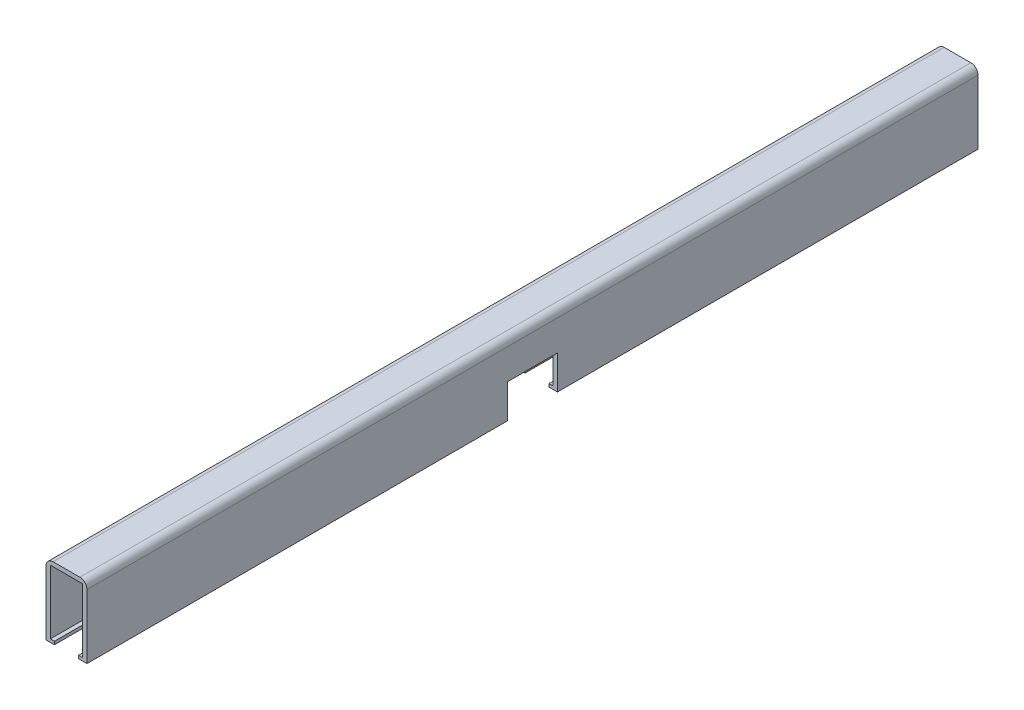
ISO-10303-21;
HEADER;
FILE_DESCRIPTION(('STEP AP214'),'2;1');
FILE_NAME('part.step','',(''),(''),'','','');
FILE_SCHEMA(('AUTOMOTIVE_DESIGN { 1 0 10303 214 1 1 1 1 }'));
ENDSEC;
DATA;
#1=APPLICATION_CONTEXT('core data for automotive mechanical design processes');
#2=APPLICATION_PROTOCOL_DEFINITION('international standard','automotive_design',2000,#1);
#3=PRODUCT_CONTEXT('',#1,'mechanical');
#4=PRODUCT('Part','Part','',(#3));
#5=PRODUCT_RELATED_PRODUCT_CATEGORY('part','',(#4));
#6=PRODUCT_DEFINITION_FORMATION('','',#4);
#7=PRODUCT_DEFINITION_CONTEXT('part definition',#1,'design');
#8=PRODUCT_DEFINITION('design','',#6,#7);
#9=PRODUCT_DEFINITION_SHAPE('','',#8);
#10=(LENGTH_UNIT() NAMED_UNIT(*) SI_UNIT(.MILLI.,.METRE.));
#11=(NAMED_UNIT(*) PLANE_ANGLE_UNIT() SI_UNIT($,.RADIAN.));
#12=(NAMED_UNIT(*) SI_UNIT($,.STERADIAN.) SOLID_ANGLE_UNIT());
#13=UNCERTAINTY_MEASURE_WITH_UNIT(LENGTH_MEASURE(1.E-05),#10,'distance_accuracy_value','');
#14=(GEOMETRIC_REPRESENTATION_CONTEXT(3) GLOBAL_UNCERTAINTY_ASSIGNED_CONTEXT((#13)) GLOBAL_UNIT_ASSIGNED_CONTEXT((#10,
#11,#12)) REPRESENTATION_CONTEXT('',''));
#15=CARTESIAN_POINT('',(0.,0.,0.));
#16=DIRECTION('',(0.,0.,1.));
#17=DIRECTION('',(1.,0.,0.));
#18=AXIS2_PLACEMENT_3D('',#15,#16,#17);
#19=CARTESIAN_POINT('',(-6.785,0.,250.));
#20=DIRECTION('',(0.,1.,0.));
#21=DIRECTION('',(0.,0.,1.));
#22=AXIS2_PLACEMENT_3D('',#19,#20,#21);
#23=PLANE('',#22);
#24=DIRECTION('',(0.,0.,-1.));
#25=VECTOR('',#24,1.);
#26=CARTESIAN_POINT('',(-11.5,0.,250.));
#27=LINE('',#26,#25);
#28=CARTESIAN_POINT('',(-11.5,0.,250.));
#29=VERTEX_POINT('',#28);
#30=CARTESIAN_POINT('',(-11.5,0.,14.));
#31=VERTEX_POINT('',#30);
#32=EDGE_CURVE('E238',#29,#31,#27,.T.);
#33=ORIENTED_EDGE('',*,*,#32,.T.);
#34=DIRECTION('',(1.,0.,0.));
#35=VECTOR('',#34,1.);
#36=CARTESIAN_POINT('',(-11.501,0.,14.));
#37=LINE('',#36,#35);
#38=CARTESIAN_POINT('',(-6.785,0.,14.));
#39=VERTEX_POINT('',#38);
#40=EDGE_CURVE('E214',#31,#39,#37,.T.);
#41=ORIENTED_EDGE('',*,*,#40,.T.);
#42=DIRECTION('',(0.,0.,-1.));
#43=VECTOR('',#42,1.);
#44=CARTESIAN_POINT('',(-6.785,0.,250.));
#45=LINE('',#44,#43);
#46=CARTESIAN_POINT('',(-6.785,0.,250.));
#47=VERTEX_POINT('',#46);
#48=EDGE_CURVE('E229',#47,#39,#45,.T.);
#49=ORIENTED_EDGE('',*,*,#48,.F.);
#50=DIRECTION('',(1.,0.,0.));
#51=VECTOR('',#50,1.);
#52=CARTESIAN_POINT('',(-6.785,0.,250.));
#53=LINE('',#52,#51);
#54=EDGE_CURVE('E372',#29,#47,#53,.T.);
#55=ORIENTED_EDGE('',*,*,#54,.F.);
#56=EDGE_LOOP('',(#33,#41,#49,#55));
#57=FACE_BOUND('',#56,.T.);
#58=ADVANCED_FACE('F32',(#57),#23,.F.);
#59=CARTESIAN_POINT('',(-6.785,0.,250.));
#60=DIRECTION('',(-1.,0.,0.));
#61=DIRECTION('',(0.,0.,1.));
#62=AXIS2_PLACEMENT_3D('',#59,#60,#61);
#63=PLANE('',#62);
#64=ORIENTED_EDGE('',*,*,#48,.T.);
#65=DIRECTION('',(0.,-1.,0.));
#66=VECTOR('',#65,1.);
#67=CARTESIAN_POINT('',(-6.785,19.,14.));
#68=LINE('',#67,#66);
#69=CARTESIAN_POINT('',(-6.785,1.73,14.));
#70=VERTEX_POINT('',#69);
#71=EDGE_CURVE('E223',#70,#39,#68,.T.);
#72=ORIENTED_EDGE('',*,*,#71,.F.);
#73=DIRECTION('',(0.,0.,-1.));
#74=VECTOR('',#73,1.);
#75=CARTESIAN_POINT('',(-6.785,1.73,250.));
#76=LINE('',#75,#74);
#77=CARTESIAN_POINT('',(-6.785,1.73,250.));
#78=VERTEX_POINT('',#77);
#79=EDGE_CURVE('E230',#78,#70,#76,.T.);
#80=ORIENTED_EDGE('',*,*,#79,.F.);
#81=DIRECTION('',(0.,1.,0.));
#82=VECTOR('',#81,1.);
#83=CARTESIAN_POINT('',(-6.785,0.,250.));
#84=LINE('',#83,#82);
#85=EDGE_CURVE('E370',#47,#78,#84,.T.);
#86=ORIENTED_EDGE('',*,*,#85,.F.);
#87=EDGE_LOOP('',(#64,#72,#80,#86));
#88=FACE_BOUND('',#87,.T.);
#89=ADVANCED_FACE('F449',(#88),#63,.F.);
#90=CARTESIAN_POINT('',(-6.785,1.73,250.));
#91=DIRECTION('',(0.,-1.,0.));
#92=DIRECTION('',(1.,0.,0.));
#93=AXIS2_PLACEMENT_3D('',#90,#91,#92);
#94=PLANE('',#93);
#95=ORIENTED_EDGE('',*,*,#79,.T.);
#96=DIRECTION('',(1.,0.,0.));
#97=VECTOR('',#96,1.);
#98=CARTESIAN_POINT('',(-11.501,1.73,14.));
#99=LINE('',#98,#97);
#100=CARTESIAN_POINT('',(-9.07,1.73,14.));
#101=VERTEX_POINT('',#100);
#102=EDGE_CURVE('E420',#101,#70,#99,.T.);
#103=ORIENTED_EDGE('',*,*,#102,.F.);
#104=DIRECTION('',(0.,0.,-1.));
#105=VECTOR('',#104,1.);
#106=CARTESIAN_POINT('',(-9.07,1.73,250.));
#107=LINE('',#106,#105);
#108=CARTESIAN_POINT('',(-9.07,1.73,250.));
#109=VERTEX_POINT('',#108);
#110=EDGE_CURVE('E330',#109,#101,#107,.T.);
#111=ORIENTED_EDGE('',*,*,#110,.F.);
#112=DIRECTION('',(-1.,0.,0.));
#113=VECTOR('',#112,1.);
#114=CARTESIAN_POINT('',(-6.785,1.73,250.));
#115=LINE('',#114,#113);
#116=EDGE_CURVE('E368',#78,#109,#115,.T.);
#117=ORIENTED_EDGE('',*,*,#116,.F.);
#118=EDGE_LOOP('',(#95,#103,#111,#117));
#119=FACE_BOUND('',#118,.T.);
#120=ADVANCED_FACE('F506',(#119),#94,.F.);
#121=CARTESIAN_POINT('',(6.785,0.,250.));
#122=DIRECTION('',(0.,1.,0.));
#123=DIRECTION('',(0.,0.,1.));
#124=AXIS2_PLACEMENT_3D('',#121,#122,#123);
#125=PLANE('',#124);
#126=DIRECTION('',(-1.,0.,0.));
#127=VECTOR('',#126,1.);
#128=CARTESIAN_POINT('',(11.501,0.,14.));
#129=LINE('',#128,#127);
#130=CARTESIAN_POINT('',(11.5,0.,14.));
#131=VERTEX_POINT('',#130);
#132=CARTESIAN_POINT('',(6.785,0.,14.));
#133=VERTEX_POINT('',#132);
#134=EDGE_CURVE('E392',#131,#133,#129,.T.);
#135=ORIENTED_EDGE('',*,*,#134,.F.);
#136=DIRECTION('',(0.,0.,-1.));
#137=VECTOR('',#136,1.);
#138=CARTESIAN_POINT('',(11.5,0.,250.));
#139=LINE('',#138,#137);
#140=CARTESIAN_POINT('',(11.5,0.,250.));
#141=VERTEX_POINT('',#140);
#142=EDGE_CURVE('E11',#141,#131,#139,.T.);
#143=ORIENTED_EDGE('',*,*,#142,.F.);
#144=DIRECTION('',(1.,0.,0.));
#145=VECTOR('',#144,1.);
#146=CARTESIAN_POINT('',(6.785,0.,250.));
#147=LINE('',#146,#145);
#148=CARTESIAN_POINT('',(6.785,0.,250.));
#149=VERTEX_POINT('',#148);
#150=EDGE_CURVE('E312',#149,#141,#147,.T.);
#151=ORIENTED_EDGE('',*,*,#150,.F.);
#152=DIRECTION('',(0.,0.,-1.));
#153=VECTOR('',#152,1.);
#154=CARTESIAN_POINT('',(6.785,0.,250.));
#155=LINE('',#154,#153);
#156=EDGE_CURVE('E313',#149,#133,#155,.T.);
#157=ORIENTED_EDGE('',*,*,#156,.T.);
#158=EDGE_LOOP('',(#135,#143,#151,#157));
#159=FACE_BOUND('',#158,.T.);
#160=ADVANCED_FACE('F34',(#159),#125,.F.);
#161=DIRECTION('',(-1.,0.,0.));
#162=VECTOR('',#161,1.);
#163=CARTESIAN_POINT('',(11.501,0.,-14.));
#164=LINE('',#163,#162);
#165=CARTESIAN_POINT('',(11.5,0.,-14.));
#166=VERTEX_POINT('',#165);
#167=CARTESIAN_POINT('',(6.785,0.,-14.));
#168=VERTEX_POINT('',#167);
#169=EDGE_CURVE('E394',#166,#168,#164,.T.);
#170=ORIENTED_EDGE('',*,*,#169,.T.);
#171=CARTESIAN_POINT('',(6.785,0.,-250.));
#172=VERTEX_POINT('',#171);
#173=EDGE_CURVE('E277',#168,#172,#155,.T.);
#174=ORIENTED_EDGE('',*,*,#173,.T.);
#175=DIRECTION('',(1.,0.,0.));
#176=VECTOR('',#175,1.);
#177=CARTESIAN_POINT('',(6.785,0.,-250.));
#178=LINE('',#177,#176);
#179=CARTESIAN_POINT('',(11.5,0.,-250.));
#180=VERTEX_POINT('',#179);
#181=EDGE_CURVE('E271',#172,#180,#178,.T.);
#182=ORIENTED_EDGE('',*,*,#181,.T.);
#183=EDGE_CURVE('E40',#166,#180,#139,.T.);
#184=ORIENTED_EDGE('',*,*,#183,.F.);
#185=EDGE_LOOP('',(#170,#174,#182,#184));
#186=FACE_BOUND('',#185,.T.);
#187=ADVANCED_FACE('F275',(#186),#125,.F.);
#188=CARTESIAN_POINT('',(11.5,0.,250.));
#189=DIRECTION('',(-1.,0.,0.));
#190=DIRECTION('',(0.,0.,1.));
#191=AXIS2_PLACEMENT_3D('',#188,#189,#190);
#192=PLANE('',#191);
#193=DIRECTION('',(0.,1.,0.));
#194=VECTOR('',#193,1.);
#195=CARTESIAN_POINT('',(11.5,19.,14.));
#196=LINE('',#195,#194);
#197=CARTESIAN_POINT('',(11.5,19.,14.));
#198=VERTEX_POINT('',#197);
#199=EDGE_CURVE('E408',#131,#198,#196,.T.);
#200=ORIENTED_EDGE('',*,*,#199,.T.);
#201=DIRECTION('',(0.,0.,-1.));
#202=VECTOR('',#201,1.);
#203=CARTESIAN_POINT('',(11.5,19.,14.));
#204=LINE('',#203,#202);
#205=CARTESIAN_POINT('',(11.5,19.,-14.));
#206=VERTEX_POINT('',#205);
#207=EDGE_CURVE('E387',#198,#206,#204,.T.);
#208=ORIENTED_EDGE('',*,*,#207,.T.);
#209=DIRECTION('',(0.,-1.,0.));
#210=VECTOR('',#209,1.);
#211=CARTESIAN_POINT('',(11.5,19.,-14.));
#212=LINE('',#211,#210);
#213=EDGE_CURVE('E263',#206,#166,#212,.T.);
#214=ORIENTED_EDGE('',*,*,#213,.T.);
#215=ORIENTED_EDGE('',*,*,#183,.T.);
#216=DIRECTION('',(0.,1.,0.));
#217=VECTOR('',#216,1.);
#218=CARTESIAN_POINT('',(11.5,0.,-250.));
#219=LINE('',#218,#217);
#220=CARTESIAN_POINT('',(11.5,36.,-250.));
#221=VERTEX_POINT('',#220);
#222=EDGE_CURVE('E261',#180,#221,#219,.T.);
#223=ORIENTED_EDGE('',*,*,#222,.T.);
#224=DIRECTION('',(0.,0.,-1.));
#225=VECTOR('',#224,1.);
#226=CARTESIAN_POINT('',(11.5,36.,250.));
#227=LINE('',#226,#225);
#228=CARTESIAN_POINT('',(11.5,36.,250.));
#229=VERTEX_POINT('',#228);
#230=EDGE_CURVE('E249',#229,#221,#227,.T.);
#231=ORIENTED_EDGE('',*,*,#230,.F.);
#232=DIRECTION('',(0.,1.,0.));
#233=VECTOR('',#232,1.);
#234=CARTESIAN_POINT('',(11.5,0.,250.));
#235=LINE('',#234,#233);
#236=EDGE_CURVE('E382',#141,#229,#235,.T.);
#237=ORIENTED_EDGE('',*,*,#236,.F.);
#238=ORIENTED_EDGE('',*,*,#142,.T.);
#239=EDGE_LOOP('',(#200,#208,#214,#215,#223,#231,#237,#238));
#240=FACE_BOUND('',#239,.T.);
#241=ADVANCED_FACE('F260',(#240),#192,.F.);
#242=CARTESIAN_POINT('',(9.07,1.73,250.));
#243=DIRECTION('',(1.,0.,0.));
#244=DIRECTION('',(0.,0.,-1.));
#245=AXIS2_PLACEMENT_3D('',#242,#243,#244);
#246=PLANE('',#245);
#247=DIRECTION('',(0.,-1.,0.));
#248=VECTOR('',#247,1.);
#249=CARTESIAN_POINT('',(9.07,19.,14.));
#250=LINE('',#249,#248);
#251=CARTESIAN_POINT('',(9.07,19.,14.));
#252=VERTEX_POINT('',#251);
#253=CARTESIAN_POINT('',(9.07,1.73,14.));
#254=VERTEX_POINT('',#253);
#255=EDGE_CURVE('E411',#252,#254,#250,.T.);
#256=ORIENTED_EDGE('',*,*,#255,.T.);
#257=DIRECTION('',(0.,0.,-1.));
#258=VECTOR('',#257,1.);
#259=CARTESIAN_POINT('',(9.07,1.73,250.));
#260=LINE('',#259,#258);
#261=CARTESIAN_POINT('',(9.07,1.73,250.));
#262=VERTEX_POINT('',#261);
#263=EDGE_CURVE('E321',#262,#254,#260,.T.);
#264=ORIENTED_EDGE('',*,*,#263,.F.);
#265=DIRECTION('',(0.,-1.,0.));
#266=VECTOR('',#265,1.);
#267=CARTESIAN_POINT('',(9.07,1.73,250.));
#268=LINE('',#267,#266);
#269=CARTESIAN_POINT('',(9.07,37.58,250.));
#270=VERTEX_POINT('',#269);
#271=EDGE_CURVE('E358',#270,#262,#268,.T.);
#272=ORIENTED_EDGE('',*,*,#271,.F.);
#273=DIRECTION('',(0.,0.,-1.));
#274=VECTOR('',#273,1.);
#275=CARTESIAN_POINT('',(9.07,37.58,250.));
#276=LINE('',#275,#274);
#277=CARTESIAN_POINT('',(9.07,37.58,-250.));
#278=VERTEX_POINT('',#277);
#279=EDGE_CURVE('E324',#270,#278,#276,.T.);
#280=ORIENTED_EDGE('',*,*,#279,.T.);
#281=DIRECTION('',(0.,-1.,0.));
#282=VECTOR('',#281,1.);
#283=CARTESIAN_POINT('',(9.07,1.73,-250.));
#284=LINE('',#283,#282);
#285=CARTESIAN_POINT('',(9.07,1.73,-250.));
#286=VERTEX_POINT('',#285);
#287=EDGE_CURVE('E304',#278,#286,#284,.T.);
#288=ORIENTED_EDGE('',*,*,#287,.T.);
#289=CARTESIAN_POINT('',(9.07,1.73,-14.));
#290=VERTEX_POINT('',#289);
#291=EDGE_CURVE('E320',#290,#286,#260,.T.);
#292=ORIENTED_EDGE('',*,*,#291,.F.);
#293=DIRECTION('',(0.,1.,0.));
#294=VECTOR('',#293,1.);
#295=CARTESIAN_POINT('',(9.07,19.,-14.));
#296=LINE('',#295,#294);
#297=CARTESIAN_POINT('',(9.07,19.,-14.));
#298=VERTEX_POINT('',#297);
#299=EDGE_CURVE('E413',#290,#298,#296,.T.);
#300=ORIENTED_EDGE('',*,*,#299,.T.);
#301=DIRECTION('',(0.,0.,1.));
#302=VECTOR('',#301,1.);
#303=CARTESIAN_POINT('',(9.07,19.,14.));
#304=LINE('',#303,#302);
#305=EDGE_CURVE('E389',#298,#252,#304,.T.);
#306=ORIENTED_EDGE('',*,*,#305,.T.);
#307=EDGE_LOOP('',(#256,#264,#272,#280,#288,#292,#300,#306));
#308=FACE_BOUND('',#307,.T.);
#309=ADVANCED_FACE('F355',(#308),#246,.F.);
#310=CARTESIAN_POINT('',(6.785,1.73,250.));
#311=DIRECTION('',(0.,-1.,0.));
#312=DIRECTION('',(1.,0.,0.));
#313=AXIS2_PLACEMENT_3D('',#310,#311,#312);
#314=PLANE('',#313);
#315=DIRECTION('',(-1.,0.,0.));
#316=VECTOR('',#315,1.);
#317=CARTESIAN_POINT('',(11.501,1.73,14.));
#318=LINE('',#317,#316);
#319=CARTESIAN_POINT('',(6.785,1.73,14.));
#320=VERTEX_POINT('',#319);
#321=EDGE_CURVE('E402',#254,#320,#318,.T.);
#322=ORIENTED_EDGE('',*,*,#321,.T.);
#323=DIRECTION('',(0.,0.,-1.));
#324=VECTOR('',#323,1.);
#325=CARTESIAN_POINT('',(6.785,1.73,250.));
#326=LINE('',#325,#324);
#327=CARTESIAN_POINT('',(6.785,1.73,250.));
#328=VERTEX_POINT('',#327);
#329=EDGE_CURVE('E317',#328,#320,#326,.T.);
#330=ORIENTED_EDGE('',*,*,#329,.F.);
#331=DIRECTION('',(-1.,0.,0.));
#332=VECTOR('',#331,1.);
#333=CARTESIAN_POINT('',(6.785,1.73,250.));
#334=LINE('',#333,#332);
#335=EDGE_CURVE('E361',#262,#328,#334,.T.);
#336=ORIENTED_EDGE('',*,*,#335,.F.);
#337=ORIENTED_EDGE('',*,*,#263,.T.);
#338=EDGE_LOOP('',(#322,#330,#336,#337));
#339=FACE_BOUND('',#338,.T.);
#340=ADVANCED_FACE('F483',(#339),#314,.F.);
#341=DIRECTION('',(1.,0.,0.));
#342=VECTOR('',#341,1.);
#343=CARTESIAN_POINT('',(11.501,1.73,-14.));
#344=LINE('',#343,#342);
#345=CARTESIAN_POINT('',(6.785,1.73,-14.));
#346=VERTEX_POINT('',#345);
#347=EDGE_CURVE('E55',#346,#290,#344,.T.);
#348=ORIENTED_EDGE('',*,*,#347,.T.);
#349=ORIENTED_EDGE('',*,*,#291,.T.);
#350=DIRECTION('',(-1.,0.,0.));
#351=VECTOR('',#350,1.);
#352=CARTESIAN_POINT('',(6.785,1.73,-250.));
#353=LINE('',#352,#351);
#354=CARTESIAN_POINT('',(6.785,1.73,-250.));
#355=VERTEX_POINT('',#354);
#356=EDGE_CURVE('E307',#286,#355,#353,.T.);
#357=ORIENTED_EDGE('',*,*,#356,.T.);
#358=EDGE_CURVE('E316',#346,#355,#326,.T.);
#359=ORIENTED_EDGE('',*,*,#358,.F.);
#360=EDGE_LOOP('',(#348,#349,#357,#359));
#361=FACE_BOUND('',#360,.T.);
#362=ADVANCED_FACE('F492',(#361),#314,.F.);
#363=CARTESIAN_POINT('',(6.785,0.,250.));
#364=DIRECTION('',(1.,0.,0.));
#365=DIRECTION('',(0.,0.,-1.));
#366=AXIS2_PLACEMENT_3D('',#363,#364,#365);
#367=PLANE('',#366);
#368=DIRECTION('',(0.,-1.,0.));
#369=VECTOR('',#368,1.);
#370=CARTESIAN_POINT('',(6.785,19.,14.));
#371=LINE('',#370,#369);
#372=EDGE_CURVE('E405',#320,#133,#371,.T.);
#373=ORIENTED_EDGE('',*,*,#372,.T.);
#374=ORIENTED_EDGE('',*,*,#156,.F.);
#375=DIRECTION('',(0.,-1.,0.));
#376=VECTOR('',#375,1.);
#377=CARTESIAN_POINT('',(6.785,0.,250.));
#378=LINE('',#377,#376);
#379=EDGE_CURVE('E283',#328,#149,#378,.T.);
#380=ORIENTED_EDGE('',*,*,#379,.F.);
#381=ORIENTED_EDGE('',*,*,#329,.T.);
#382=EDGE_LOOP('',(#373,#374,#380,#381));
#383=FACE_BOUND('',#382,.T.);
#384=ADVANCED_FACE('F479',(#383),#367,.F.);
#385=DIRECTION('',(0.,1.,0.));
#386=VECTOR('',#385,1.);
#387=CARTESIAN_POINT('',(6.785,19.,-14.));
#388=LINE('',#387,#386);
#389=EDGE_CURVE('E280',#168,#346,#388,.T.);
#390=ORIENTED_EDGE('',*,*,#389,.T.);
#391=ORIENTED_EDGE('',*,*,#358,.T.);
#392=DIRECTION('',(0.,-1.,0.));
#393=VECTOR('',#392,1.);
#394=CARTESIAN_POINT('',(6.785,0.,-250.));
#395=LINE('',#394,#393);
#396=EDGE_CURVE('E310',#355,#172,#395,.T.);
#397=ORIENTED_EDGE('',*,*,#396,.T.);
#398=ORIENTED_EDGE('',*,*,#173,.F.);
#399=EDGE_LOOP('',(#390,#391,#397,#398));
#400=FACE_BOUND('',#399,.T.);
#401=ADVANCED_FACE('F489',(#400),#367,.F.);
#402=CARTESIAN_POINT('',(7.5,36.,250.));
#403=DIRECTION('',(0.,0.,-1.));
#404=DIRECTION('',(-1.,0.,0.));
#405=AXIS2_PLACEMENT_3D('',#402,#403,#404);
#406=CYLINDRICAL_SURFACE('',#405,4.);
#407=CARTESIAN_POINT('',(7.5,36.,-250.));
#408=DIRECTION('',(0.,0.,1.));
#409=DIRECTION('',(1.,0.,0.));
#410=AXIS2_PLACEMENT_3D('',#407,#408,#409);
#411=CIRCLE('',#410,4.);
#412=CARTESIAN_POINT('',(7.49999999999997,40.,-250.));
#413=VERTEX_POINT('',#412);
#414=EDGE_CURVE('E273',#221,#413,#411,.T.);
#415=ORIENTED_EDGE('',*,*,#414,.T.);
#416=DIRECTION('',(0.,0.,-1.));
#417=VECTOR('',#416,1.);
#418=CARTESIAN_POINT('',(7.49999999999997,40.,250.));
#419=LINE('',#418,#417);
#420=CARTESIAN_POINT('',(7.49999999999997,40.,250.));
#421=VERTEX_POINT('',#420);
#422=EDGE_CURVE('E247',#421,#413,#419,.T.);
#423=ORIENTED_EDGE('',*,*,#422,.F.);
#424=CARTESIAN_POINT('',(7.5,36.,250.));
#425=DIRECTION('',(0.,0.,1.));
#426=DIRECTION('',(1.,0.,0.));
#427=AXIS2_PLACEMENT_3D('',#424,#425,#426);
#428=CIRCLE('',#427,4.);
#429=EDGE_CURVE('E380',#229,#421,#428,.T.);
#430=ORIENTED_EDGE('',*,*,#429,.F.);
#431=ORIENTED_EDGE('',*,*,#230,.T.);
#432=EDGE_LOOP('',(#415,#423,#430,#431));
#433=FACE_BOUND('',#432,.T.);
#434=ADVANCED_FACE('F469',(#433),#406,.T.);
#435=CARTESIAN_POINT('',(7.49999999999997,40.,250.));
#436=DIRECTION('',(0.,-1.,0.));
#437=DIRECTION('',(0.,0.,-1.));
#438=AXIS2_PLACEMENT_3D('',#435,#436,#437);
#439=PLANE('',#438);
#440=DIRECTION('',(-1.,0.,0.));
#441=VECTOR('',#440,1.);
#442=CARTESIAN_POINT('',(7.49999999999997,40.,-250.));
#443=LINE('',#442,#441);
#444=CARTESIAN_POINT('',(-7.49999999999997,40.,-250.));
#445=VERTEX_POINT('',#444);
#446=EDGE_CURVE('E287',#413,#445,#443,.T.);
#447=ORIENTED_EDGE('',*,*,#446,.T.);
#448=DIRECTION('',(0.,0.,-1.));
#449=VECTOR('',#448,1.);
#450=CARTESIAN_POINT('',(-7.49999999999997,40.,250.));
#451=LINE('',#450,#449);
#452=CARTESIAN_POINT('',(-7.49999999999997,40.,250.));
#453=VERTEX_POINT('',#452);
#454=EDGE_CURVE('E244',#453,#445,#451,.T.);
#455=ORIENTED_EDGE('',*,*,#454,.F.);
#456=DIRECTION('',(-1.,0.,0.));
#457=VECTOR('',#456,1.);
#458=CARTESIAN_POINT('',(7.49999999999997,40.,250.));
#459=LINE('',#458,#457);
#460=EDGE_CURVE('E378',#421,#453,#459,.T.);
#461=ORIENTED_EDGE('',*,*,#460,.F.);
#462=ORIENTED_EDGE('',*,*,#422,.T.);
#463=EDGE_LOOP('',(#447,#455,#461,#462));
#464=FACE_BOUND('',#463,.T.);
#465=ADVANCED_FACE('F467',(#464),#439,.F.);
#466=CARTESIAN_POINT('',(-7.5,36.,250.));
#467=DIRECTION('',(0.,0.,-1.));
#468=DIRECTION('',(-1.,0.,0.));
#469=AXIS2_PLACEMENT_3D('',#466,#467,#468);
#470=CYLINDRICAL_SURFACE('',#469,4.);
#471=CARTESIAN_POINT('',(-7.5,36.,-250.));
#472=DIRECTION('',(0.,0.,1.));
#473=DIRECTION('',(-1.,0.,0.));
#474=AXIS2_PLACEMENT_3D('',#471,#472,#473);
#475=CIRCLE('',#474,4.);
#476=CARTESIAN_POINT('',(-11.5,36.,-250.));
#477=VERTEX_POINT('',#476);
#478=EDGE_CURVE('E289',#445,#477,#475,.T.);
#479=ORIENTED_EDGE('',*,*,#478,.T.);
#480=DIRECTION('',(0.,0.,-1.));
#481=VECTOR('',#480,1.);
#482=CARTESIAN_POINT('',(-11.5,36.,250.));
#483=LINE('',#482,#481);
#484=CARTESIAN_POINT('',(-11.5,36.,250.));
#485=VERTEX_POINT('',#484);
#486=EDGE_CURVE('E241',#485,#477,#483,.T.);
#487=ORIENTED_EDGE('',*,*,#486,.F.);
#488=CARTESIAN_POINT('',(-7.5,36.,250.));
#489=DIRECTION('',(0.,0.,1.));
#490=DIRECTION('',(-1.,0.,0.));
#491=AXIS2_PLACEMENT_3D('',#488,#489,#490);
#492=CIRCLE('',#491,4.);
#493=EDGE_CURVE('E376',#453,#485,#492,.T.);
#494=ORIENTED_EDGE('',*,*,#493,.F.);
#495=ORIENTED_EDGE('',*,*,#454,.T.);
#496=EDGE_LOOP('',(#479,#487,#494,#495));
#497=FACE_BOUND('',#496,.T.);
#498=ADVANCED_FACE('F463',(#497),#470,.T.);
#499=CARTESIAN_POINT('',(-11.5,0.,250.));
#500=DIRECTION('',(1.,0.,0.));
#501=DIRECTION('',(0.,0.,-1.));
#502=AXIS2_PLACEMENT_3D('',#499,#500,#501);
#503=PLANE('',#502);
#504=DIRECTION('',(0.,0.,-1.));
#505=VECTOR('',#504,1.);
#506=CARTESIAN_POINT('',(-11.5,19.,14.));
#507=LINE('',#506,#505);
#508=CARTESIAN_POINT('',(-11.5,19.,14.));
#509=VERTEX_POINT('',#508);
#510=CARTESIAN_POINT('',(-11.5,19.,-14.));
#511=VERTEX_POINT('',#510);
#512=EDGE_CURVE('E433',#509,#511,#507,.T.);
#513=ORIENTED_EDGE('',*,*,#512,.F.);
#514=DIRECTION('',(0.,1.,0.));
#515=VECTOR('',#514,1.);
#516=CARTESIAN_POINT('',(-11.5,19.,14.));
#517=LINE('',#516,#515);
#518=EDGE_CURVE('E430',#31,#509,#517,.T.);
#519=ORIENTED_EDGE('',*,*,#518,.F.);
#520=ORIENTED_EDGE('',*,*,#32,.F.);
#521=DIRECTION('',(0.,-1.,0.));
#522=VECTOR('',#521,1.);
#523=CARTESIAN_POINT('',(-11.5,0.,250.));
#524=LINE('',#523,#522);
#525=EDGE_CURVE('E374',#485,#29,#524,.T.);
#526=ORIENTED_EDGE('',*,*,#525,.F.);
#527=ORIENTED_EDGE('',*,*,#486,.T.);
#528=DIRECTION('',(0.,-1.,0.));
#529=VECTOR('',#528,1.);
#530=CARTESIAN_POINT('',(-11.5,0.,-250.));
#531=LINE('',#530,#529);
#532=CARTESIAN_POINT('',(-11.5,0.,-250.));
#533=VERTEX_POINT('',#532);
#534=EDGE_CURVE('E291',#477,#533,#531,.T.);
#535=ORIENTED_EDGE('',*,*,#534,.T.);
#536=CARTESIAN_POINT('',(-11.5,0.,-14.));
#537=VERTEX_POINT('',#536);
#538=EDGE_CURVE('E233',#537,#533,#27,.T.);
#539=ORIENTED_EDGE('',*,*,#538,.F.);
#540=DIRECTION('',(0.,-1.,0.));
#541=VECTOR('',#540,1.);
#542=CARTESIAN_POINT('',(-11.5,19.,-14.));
#543=LINE('',#542,#541);
#544=EDGE_CURVE('E209',#511,#537,#543,.T.);
#545=ORIENTED_EDGE('',*,*,#544,.F.);
#546=EDGE_LOOP('',(#513,#519,#520,#526,#527,#535,#539,#545));
#547=FACE_BOUND('',#546,.T.);
#548=ADVANCED_FACE('F457',(#547),#503,.F.);
#549=CARTESIAN_POINT('',(-6.785,0.,-14.));
#550=VERTEX_POINT('',#549);
#551=CARTESIAN_POINT('',(-6.785,0.,-250.));
#552=VERTEX_POINT('',#551);
#553=EDGE_CURVE('E220',#550,#552,#45,.T.);
#554=ORIENTED_EDGE('',*,*,#553,.F.);
#555=DIRECTION('',(1.,0.,0.));
#556=VECTOR('',#555,1.);
#557=CARTESIAN_POINT('',(-11.501,0.,-14.));
#558=LINE('',#557,#556);
#559=EDGE_CURVE('E204',#537,#550,#558,.T.);
#560=ORIENTED_EDGE('',*,*,#559,.F.);
#561=ORIENTED_EDGE('',*,*,#538,.T.);
#562=DIRECTION('',(1.,0.,0.));
#563=VECTOR('',#562,1.);
#564=CARTESIAN_POINT('',(-6.785,0.,-250.));
#565=LINE('',#564,#563);
#566=EDGE_CURVE('E227',#533,#552,#565,.T.);
#567=ORIENTED_EDGE('',*,*,#566,.T.);
#568=EDGE_LOOP('',(#554,#560,#561,#567));
#569=FACE_BOUND('',#568,.T.);
#570=ADVANCED_FACE('F225',(#569),#23,.F.);
#571=CARTESIAN_POINT('',(-6.785,1.73,-14.));
#572=VERTEX_POINT('',#571);
#573=CARTESIAN_POINT('',(-6.785,1.73,-250.));
#574=VERTEX_POINT('',#573);
#575=EDGE_CURVE('E222',#572,#574,#76,.T.);
#576=ORIENTED_EDGE('',*,*,#575,.F.);
#577=DIRECTION('',(0.,1.,0.));
#578=VECTOR('',#577,1.);
#579=CARTESIAN_POINT('',(-6.785,19.,-14.));
#580=LINE('',#579,#578);
#581=EDGE_CURVE('E207',#550,#572,#580,.T.);
#582=ORIENTED_EDGE('',*,*,#581,.F.);
#583=ORIENTED_EDGE('',*,*,#553,.T.);
#584=DIRECTION('',(0.,1.,0.));
#585=VECTOR('',#584,1.);
#586=CARTESIAN_POINT('',(-6.785,0.,-250.));
#587=LINE('',#586,#585);
#588=EDGE_CURVE('E295',#552,#574,#587,.T.);
#589=ORIENTED_EDGE('',*,*,#588,.T.);
#590=EDGE_LOOP('',(#576,#582,#583,#589));
#591=FACE_BOUND('',#590,.T.);
#592=ADVANCED_FACE('F218',(#591),#63,.F.);
#593=CARTESIAN_POINT('',(-9.07,1.73,-14.));
#594=VERTEX_POINT('',#593);
#595=CARTESIAN_POINT('',(-9.07,1.73,-250.));
#596=VERTEX_POINT('',#595);
#597=EDGE_CURVE('E329',#594,#596,#107,.T.);
#598=ORIENTED_EDGE('',*,*,#597,.F.);
#599=DIRECTION('',(-1.,0.,0.));
#600=VECTOR('',#599,1.);
#601=CARTESIAN_POINT('',(-11.501,1.73,-14.));
#602=LINE('',#601,#600);
#603=EDGE_CURVE('E47',#572,#594,#602,.T.);
#604=ORIENTED_EDGE('',*,*,#603,.F.);
#605=ORIENTED_EDGE('',*,*,#575,.T.);
#606=DIRECTION('',(-1.,0.,0.));
#607=VECTOR('',#606,1.);
#608=CARTESIAN_POINT('',(-6.785,1.73,-250.));
#609=LINE('',#608,#607);
#610=EDGE_CURVE('E297',#574,#596,#609,.T.);
#611=ORIENTED_EDGE('',*,*,#610,.T.);
#612=EDGE_LOOP('',(#598,#604,#605,#611));
#613=FACE_BOUND('',#612,.T.);
#614=ADVANCED_FACE('F344',(#613),#94,.F.);
#615=CARTESIAN_POINT('',(-9.07,1.73,250.));
#616=DIRECTION('',(-1.,0.,0.));
#617=DIRECTION('',(0.,0.,1.));
#618=AXIS2_PLACEMENT_3D('',#615,#616,#617);
#619=PLANE('',#618);
#620=ORIENTED_EDGE('',*,*,#110,.T.);
#621=DIRECTION('',(0.,-1.,0.));
#622=VECTOR('',#621,1.);
#623=CARTESIAN_POINT('',(-9.07,19.,14.));
#624=LINE('',#623,#622);
#625=CARTESIAN_POINT('',(-9.07,19.,14.));
#626=VERTEX_POINT('',#625);
#627=EDGE_CURVE('E425',#626,#101,#624,.T.);
#628=ORIENTED_EDGE('',*,*,#627,.F.);
#629=DIRECTION('',(0.,0.,1.));
#630=VECTOR('',#629,1.);
#631=CARTESIAN_POINT('',(-9.07,19.,14.));
#632=LINE('',#631,#630);
#633=CARTESIAN_POINT('',(-9.07,19.,-14.));
#634=VERTEX_POINT('',#633);
#635=EDGE_CURVE('E427',#634,#626,#632,.T.);
#636=ORIENTED_EDGE('',*,*,#635,.F.);
#637=DIRECTION('',(0.,1.,0.));
#638=VECTOR('',#637,1.);
#639=CARTESIAN_POINT('',(-9.07,19.,-14.));
#640=LINE('',#639,#638);
#641=EDGE_CURVE('E341',#594,#634,#640,.T.);
#642=ORIENTED_EDGE('',*,*,#641,.F.);
#643=ORIENTED_EDGE('',*,*,#597,.T.);
#644=DIRECTION('',(0.,1.,0.));
#645=VECTOR('',#644,1.);
#646=CARTESIAN_POINT('',(-9.07,1.73,-250.));
#647=LINE('',#646,#645);
#648=CARTESIAN_POINT('',(-9.07,37.58,-250.));
#649=VERTEX_POINT('',#648);
#650=EDGE_CURVE('E300',#596,#649,#647,.T.);
#651=ORIENTED_EDGE('',*,*,#650,.T.);
#652=DIRECTION('',(0.,0.,-1.));
#653=VECTOR('',#652,1.);
#654=CARTESIAN_POINT('',(-9.07,37.58,250.));
#655=LINE('',#654,#653);
#656=CARTESIAN_POINT('',(-9.07,37.58,250.));
#657=VERTEX_POINT('',#656);
#658=EDGE_CURVE('E327',#657,#649,#655,.T.);
#659=ORIENTED_EDGE('',*,*,#658,.F.);
#660=DIRECTION('',(0.,1.,0.));
#661=VECTOR('',#660,1.);
#662=CARTESIAN_POINT('',(-9.07,1.73,250.));
#663=LINE('',#662,#661);
#664=EDGE_CURVE('E364',#109,#657,#663,.T.);
#665=ORIENTED_EDGE('',*,*,#664,.F.);
#666=EDGE_LOOP('',(#620,#628,#636,#642,#643,#651,#659,#665));
#667=FACE_BOUND('',#666,.T.);
#668=ADVANCED_FACE('F337',(#667),#619,.F.);
#669=CARTESIAN_POINT('',(9.07,37.58,250.));
#670=DIRECTION('',(0.,1.,0.));
#671=DIRECTION('',(0.,0.,1.));
#672=AXIS2_PLACEMENT_3D('',#669,#670,#671);
#673=PLANE('',#672);
#674=DIRECTION('',(1.,0.,0.));
#675=VECTOR('',#674,1.);
#676=CARTESIAN_POINT('',(9.07,37.58,-250.));
#677=LINE('',#676,#675);
#678=EDGE_CURVE('E302',#649,#278,#677,.T.);
#679=ORIENTED_EDGE('',*,*,#678,.T.);
#680=ORIENTED_EDGE('',*,*,#279,.F.);
#681=DIRECTION('',(1.,0.,0.));
#682=VECTOR('',#681,1.);
#683=CARTESIAN_POINT('',(9.07,37.58,250.));
#684=LINE('',#683,#682);
#685=EDGE_CURVE('E362',#657,#270,#684,.T.);
#686=ORIENTED_EDGE('',*,*,#685,.F.);
#687=ORIENTED_EDGE('',*,*,#658,.T.);
#688=EDGE_LOOP('',(#679,#680,#686,#687));
#689=FACE_BOUND('',#688,.T.);
#690=ADVANCED_FACE('F350',(#689),#673,.F.);
#691=CARTESIAN_POINT('',(7.5,36.,250.));
#692=DIRECTION('',(0.,0.,1.));
#693=DIRECTION('',(1.,0.,0.));
#694=AXIS2_PLACEMENT_3D('',#691,#692,#693);
#695=PLANE('',#694);
#696=ORIENTED_EDGE('',*,*,#150,.T.);
#697=ORIENTED_EDGE('',*,*,#236,.T.);
#698=ORIENTED_EDGE('',*,*,#429,.T.);
#699=ORIENTED_EDGE('',*,*,#460,.T.);
#700=ORIENTED_EDGE('',*,*,#493,.T.);
#701=ORIENTED_EDGE('',*,*,#525,.T.);
#702=ORIENTED_EDGE('',*,*,#54,.T.);
#703=ORIENTED_EDGE('',*,*,#85,.T.);
#704=ORIENTED_EDGE('',*,*,#116,.T.);
#705=ORIENTED_EDGE('',*,*,#664,.T.);
#706=ORIENTED_EDGE('',*,*,#685,.T.);
#707=ORIENTED_EDGE('',*,*,#271,.T.);
#708=ORIENTED_EDGE('',*,*,#335,.T.);
#709=ORIENTED_EDGE('',*,*,#379,.T.);
#710=EDGE_LOOP('',(#696,#697,#698,#699,#700,#701,#702,#703,#704,#705,#706,#707,#708,#709));
#711=FACE_BOUND('',#710,.T.);
#712=ADVANCED_FACE('F451',(#711),#695,.T.);
#713=CARTESIAN_POINT('',(7.5,36.,-250.));
#714=DIRECTION('',(0.,0.,1.));
#715=DIRECTION('',(1.,0.,0.));
#716=AXIS2_PLACEMENT_3D('',#713,#714,#715);
#717=PLANE('',#716);
#718=ORIENTED_EDGE('',*,*,#181,.F.);
#719=ORIENTED_EDGE('',*,*,#396,.F.);
#720=ORIENTED_EDGE('',*,*,#356,.F.);
#721=ORIENTED_EDGE('',*,*,#287,.F.);
#722=ORIENTED_EDGE('',*,*,#678,.F.);
#723=ORIENTED_EDGE('',*,*,#650,.F.);
#724=ORIENTED_EDGE('',*,*,#610,.F.);
#725=ORIENTED_EDGE('',*,*,#588,.F.);
#726=ORIENTED_EDGE('',*,*,#566,.F.);
#727=ORIENTED_EDGE('',*,*,#534,.F.);
#728=ORIENTED_EDGE('',*,*,#478,.F.);
#729=ORIENTED_EDGE('',*,*,#446,.F.);
#730=ORIENTED_EDGE('',*,*,#414,.F.);
#731=ORIENTED_EDGE('',*,*,#222,.F.);
#732=EDGE_LOOP('',(#718,#719,#720,#721,#722,#723,#724,#725,#726,#727,#728,#729,#730,#731));
#733=FACE_BOUND('',#732,.T.);
#734=ADVANCED_FACE('F269',(#733),#717,.F.);
#735=CARTESIAN_POINT('',(11.501,19.,14.));
#736=DIRECTION('',(0.,0.,-1.));
#737=DIRECTION('',(0.,1.,0.));
#738=AXIS2_PLACEMENT_3D('',#735,#736,#737);
#739=PLANE('',#738);
#740=ORIENTED_EDGE('',*,*,#134,.T.);
#741=ORIENTED_EDGE('',*,*,#372,.F.);
#742=ORIENTED_EDGE('',*,*,#321,.F.);
#743=ORIENTED_EDGE('',*,*,#255,.F.);
#744=DIRECTION('',(-1.,0.,0.));
#745=VECTOR('',#744,1.);
#746=CARTESIAN_POINT('',(11.501,19.,14.));
#747=LINE('',#746,#745);
#748=EDGE_CURVE('E399',#198,#252,#747,.T.);
#749=ORIENTED_EDGE('',*,*,#748,.F.);
#750=ORIENTED_EDGE('',*,*,#199,.F.);
#751=EDGE_LOOP('',(#740,#741,#742,#743,#749,#750));
#752=FACE_BOUND('',#751,.T.);
#753=ADVANCED_FACE('F476',(#752),#739,.T.);
#754=CARTESIAN_POINT('',(11.501,19.,-14.));
#755=DIRECTION('',(0.,0.,1.));
#756=DIRECTION('',(0.,-1.,0.));
#757=AXIS2_PLACEMENT_3D('',#754,#755,#756);
#758=PLANE('',#757);
#759=DIRECTION('',(-1.,0.,0.));
#760=VECTOR('',#759,1.);
#761=CARTESIAN_POINT('',(11.501,19.,-14.));
#762=LINE('',#761,#760);
#763=EDGE_CURVE('E396',#206,#298,#762,.T.);
#764=ORIENTED_EDGE('',*,*,#763,.T.);
#765=ORIENTED_EDGE('',*,*,#299,.F.);
#766=ORIENTED_EDGE('',*,*,#347,.F.);
#767=ORIENTED_EDGE('',*,*,#389,.F.);
#768=ORIENTED_EDGE('',*,*,#169,.F.);
#769=ORIENTED_EDGE('',*,*,#213,.F.);
#770=EDGE_LOOP('',(#764,#765,#766,#767,#768,#769));
#771=FACE_BOUND('',#770,.T.);
#772=ADVANCED_FACE('F487',(#771),#758,.T.);
#773=CARTESIAN_POINT('',(11.501,19.,14.));
#774=DIRECTION('',(0.,-1.,0.));
#775=DIRECTION('',(0.,0.,-1.));
#776=AXIS2_PLACEMENT_3D('',#773,#774,#775);
#777=PLANE('',#776);
#778=ORIENTED_EDGE('',*,*,#748,.T.);
#779=ORIENTED_EDGE('',*,*,#305,.F.);
#780=ORIENTED_EDGE('',*,*,#763,.F.);
#781=ORIENTED_EDGE('',*,*,#207,.F.);
#782=EDGE_LOOP('',(#778,#779,#780,#781));
#783=FACE_BOUND('',#782,.T.);
#784=ADVANCED_FACE('F486',(#783),#777,.T.);
#785=CARTESIAN_POINT('',(-11.501,19.,14.));
#786=DIRECTION('',(0.,0.,1.));
#787=DIRECTION('',(0.,-1.,0.));
#788=AXIS2_PLACEMENT_3D('',#785,#786,#787);
#789=PLANE('',#788);
#790=ORIENTED_EDGE('',*,*,#518,.T.);
#791=DIRECTION('',(1.,0.,0.));
#792=VECTOR('',#791,1.);
#793=CARTESIAN_POINT('',(-11.501,19.,14.));
#794=LINE('',#793,#792);
#795=EDGE_CURVE('E418',#509,#626,#794,.T.);
#796=ORIENTED_EDGE('',*,*,#795,.T.);
#797=ORIENTED_EDGE('',*,*,#627,.T.);
#798=ORIENTED_EDGE('',*,*,#102,.T.);
#799=ORIENTED_EDGE('',*,*,#71,.T.);
#800=ORIENTED_EDGE('',*,*,#40,.F.);
#801=EDGE_LOOP('',(#790,#796,#797,#798,#799,#800));
#802=FACE_BOUND('',#801,.T.);
#803=ADVANCED_FACE('F439',(#802),#789,.F.);
#804=CARTESIAN_POINT('',(-11.501,19.,14.));
#805=DIRECTION('',(0.,1.,0.));
#806=DIRECTION('',(0.,0.,1.));
#807=AXIS2_PLACEMENT_3D('',#804,#805,#806);
#808=PLANE('',#807);
#809=ORIENTED_EDGE('',*,*,#512,.T.);
#810=DIRECTION('',(1.,0.,0.));
#811=VECTOR('',#810,1.);
#812=CARTESIAN_POINT('',(-11.501,19.,-14.));
#813=LINE('',#812,#811);
#814=EDGE_CURVE('E213',#511,#634,#813,.T.);
#815=ORIENTED_EDGE('',*,*,#814,.T.);
#816=ORIENTED_EDGE('',*,*,#635,.T.);
#817=ORIENTED_EDGE('',*,*,#795,.F.);
#818=EDGE_LOOP('',(#809,#815,#816,#817));
#819=FACE_BOUND('',#818,.T.);
#820=ADVANCED_FACE('F459',(#819),#808,.F.);
#821=CARTESIAN_POINT('',(-11.501,19.,-14.));
#822=DIRECTION('',(0.,0.,-1.));
#823=DIRECTION('',(0.,1.,0.));
#824=AXIS2_PLACEMENT_3D('',#821,#822,#823);
#825=PLANE('',#824);
#826=ORIENTED_EDGE('',*,*,#544,.T.);
#827=ORIENTED_EDGE('',*,*,#559,.T.);
#828=ORIENTED_EDGE('',*,*,#581,.T.);
#829=ORIENTED_EDGE('',*,*,#603,.T.);
#830=ORIENTED_EDGE('',*,*,#641,.T.);
#831=ORIENTED_EDGE('',*,*,#814,.F.);
#832=EDGE_LOOP('',(#826,#827,#828,#829,#830,#831));
#833=FACE_BOUND('',#832,.T.);
#834=ADVANCED_FACE('F206',(#833),#825,.F.);
#835=CLOSED_SHELL('',(#58,#89,#120,#160,#187,#241,#309,#340,#362,#384,#401,#434,#465,#498,#548,
#570,#592,#614,#668,#690,#712,#734,#753,#772,#784,#803,#820,#834));
#836=MANIFOLD_SOLID_BREP('B2',#835);
#837=ADVANCED_BREP_SHAPE_REPRESENTATION('',(#18,#836),#14);
#838=SHAPE_DEFINITION_REPRESENTATION(#9,#837);
ENDSEC;
END-ISO-10303-21;
